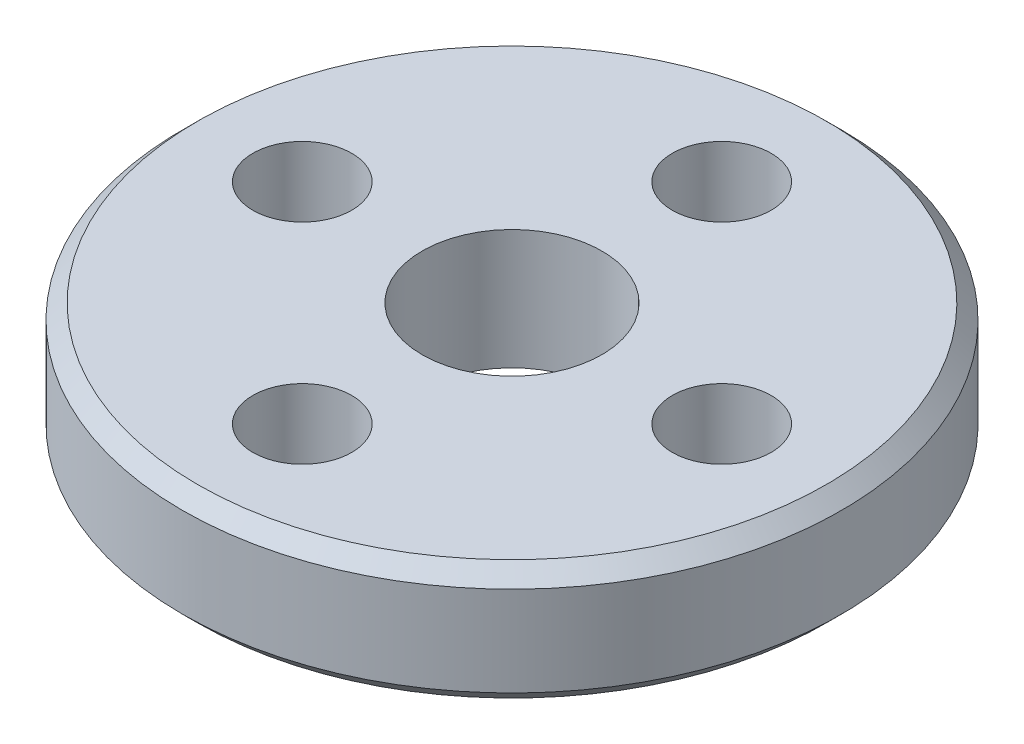
ISO-10303-21;
HEADER;
FILE_DESCRIPTION(('STEP AP214'),'2;1');
FILE_NAME('part.step','',(''),(''),'','','');
FILE_SCHEMA(('AUTOMOTIVE_DESIGN { 1 0 10303 214 1 1 1 1 }'));
ENDSEC;
DATA;
#1=APPLICATION_CONTEXT('core data for automotive mechanical design processes');
#2=APPLICATION_PROTOCOL_DEFINITION('international standard','automotive_design',2000,#1);
#3=PRODUCT_CONTEXT('',#1,'mechanical');
#4=PRODUCT('Part','Part','',(#3));
#5=PRODUCT_RELATED_PRODUCT_CATEGORY('part','',(#4));
#6=PRODUCT_DEFINITION_FORMATION('','',#4);
#7=PRODUCT_DEFINITION_CONTEXT('part definition',#1,'design');
#8=PRODUCT_DEFINITION('design','',#6,#7);
#9=PRODUCT_DEFINITION_SHAPE('','',#8);
#10=(LENGTH_UNIT() NAMED_UNIT(*) SI_UNIT(.MILLI.,.METRE.));
#11=(NAMED_UNIT(*) PLANE_ANGLE_UNIT() SI_UNIT($,.RADIAN.));
#12=(NAMED_UNIT(*) SI_UNIT($,.STERADIAN.) SOLID_ANGLE_UNIT());
#13=UNCERTAINTY_MEASURE_WITH_UNIT(LENGTH_MEASURE(1.E-05),#10,'distance_accuracy_value','');
#14=(GEOMETRIC_REPRESENTATION_CONTEXT(3) GLOBAL_UNCERTAINTY_ASSIGNED_CONTEXT((#13)) GLOBAL_UNIT_ASSIGNED_CONTEXT((#10,
#11,#12)) REPRESENTATION_CONTEXT('',''));
#15=CARTESIAN_POINT('',(0.,0.,0.));
#16=DIRECTION('',(0.,0.,1.));
#17=DIRECTION('',(1.,0.,0.));
#18=AXIS2_PLACEMENT_3D('',#15,#16,#17);
#19=CARTESIAN_POINT('',(0.,4.,0.));
#20=DIRECTION('',(0.,1.,0.));
#21=DIRECTION('',(0.,0.,1.));
#22=AXIS2_PLACEMENT_3D('',#19,#20,#21);
#23=PLANE('',#22);
#24=CARTESIAN_POINT('',(0.,4.,0.));
#25=DIRECTION('',(0.,1.,0.));
#26=DIRECTION('',(0.,0.,1.));
#27=AXIS2_PLACEMENT_3D('',#24,#25,#26);
#28=CIRCLE('',#27,10.5);
#29=CARTESIAN_POINT('',(0.,4.,10.5));
#30=VERTEX_POINT('',#29);
#31=EDGE_CURVE('E10',#30,#30,#28,.T.);
#32=ORIENTED_EDGE('',*,*,#31,.T.);
#33=EDGE_LOOP('',(#32));
#34=FACE_BOUND('',#33,.T.);
#35=CARTESIAN_POINT('',(0.,4.,7.));
#36=DIRECTION('',(0.,1.,0.));
#37=DIRECTION('',(0.,0.,1.));
#38=AXIS2_PLACEMENT_3D('',#35,#36,#37);
#39=CIRCLE('',#38,1.65);
#40=CARTESIAN_POINT('',(0.,4.,8.65));
#41=VERTEX_POINT('',#40);
#42=EDGE_CURVE('E80',#41,#41,#39,.T.);
#43=ORIENTED_EDGE('',*,*,#42,.F.);
#44=EDGE_LOOP('',(#43));
#45=FACE_BOUND('',#44,.T.);
#46=CARTESIAN_POINT('',(0.,4.,0.));
#47=DIRECTION('',(0.,1.,0.));
#48=DIRECTION('',(0.,0.,1.));
#49=AXIS2_PLACEMENT_3D('',#46,#47,#48);
#50=CIRCLE('',#49,3.);
#51=CARTESIAN_POINT('',(0.,4.,3.));
#52=VERTEX_POINT('',#51);
#53=EDGE_CURVE('E68',#52,#52,#50,.T.);
#54=ORIENTED_EDGE('',*,*,#53,.F.);
#55=EDGE_LOOP('',(#54));
#56=FACE_BOUND('',#55,.T.);
#57=CARTESIAN_POINT('',(0.,4.,-7.));
#58=DIRECTION('',(0.,1.,0.));
#59=DIRECTION('',(0.,0.,1.));
#60=AXIS2_PLACEMENT_3D('',#57,#58,#59);
#61=CIRCLE('',#60,1.65);
#62=CARTESIAN_POINT('',(0.,4.,-5.35));
#63=VERTEX_POINT('',#62);
#64=EDGE_CURVE('E61',#63,#63,#61,.T.);
#65=ORIENTED_EDGE('',*,*,#64,.F.);
#66=EDGE_LOOP('',(#65));
#67=FACE_BOUND('',#66,.T.);
#68=CARTESIAN_POINT('',(7.,4.,0.));
#69=DIRECTION('',(0.,1.,0.));
#70=DIRECTION('',(0.,0.,1.));
#71=AXIS2_PLACEMENT_3D('',#68,#69,#70);
#72=CIRCLE('',#71,1.65);
#73=CARTESIAN_POINT('',(7.,4.,1.65000000000002));
#74=VERTEX_POINT('',#73);
#75=EDGE_CURVE('E75',#74,#74,#72,.T.);
#76=ORIENTED_EDGE('',*,*,#75,.F.);
#77=EDGE_LOOP('',(#76));
#78=FACE_BOUND('',#77,.T.);
#79=CARTESIAN_POINT('',(-7.,4.,0.));
#80=DIRECTION('',(0.,1.,0.));
#81=DIRECTION('',(0.,0.,1.));
#82=AXIS2_PLACEMENT_3D('',#79,#80,#81);
#83=CIRCLE('',#82,1.65);
#84=CARTESIAN_POINT('',(-7.,4.,1.64999999999993));
#85=VERTEX_POINT('',#84);
#86=EDGE_CURVE('E85',#85,#85,#83,.T.);
#87=ORIENTED_EDGE('',*,*,#86,.F.);
#88=EDGE_LOOP('',(#87));
#89=FACE_BOUND('',#88,.T.);
#90=ADVANCED_FACE('F41',(#34,#45,#56,#67,#78,#89),#23,.T.);
#91=CARTESIAN_POINT('',(0.,0.,0.));
#92=DIRECTION('',(0.,1.,0.));
#93=DIRECTION('',(0.,0.,1.));
#94=AXIS2_PLACEMENT_3D('',#91,#92,#93);
#95=PLANE('',#94);
#96=CARTESIAN_POINT('',(0.,0.,0.));
#97=DIRECTION('',(0.,1.,0.));
#98=DIRECTION('',(0.,0.,1.));
#99=AXIS2_PLACEMENT_3D('',#96,#97,#98);
#100=CIRCLE('',#99,10.5);
#101=CARTESIAN_POINT('',(0.,0.,10.5));
#102=VERTEX_POINT('',#101);
#103=EDGE_CURVE('E47',#102,#102,#100,.F.);
#104=ORIENTED_EDGE('',*,*,#103,.T.);
#105=EDGE_LOOP('',(#104));
#106=FACE_BOUND('',#105,.T.);
#107=CARTESIAN_POINT('',(0.,0.,-7.));
#108=DIRECTION('',(0.,1.,0.));
#109=DIRECTION('',(0.,0.,1.));
#110=AXIS2_PLACEMENT_3D('',#107,#108,#109);
#111=CIRCLE('',#110,1.65);
#112=CARTESIAN_POINT('',(0.,0.,-5.35));
#113=VERTEX_POINT('',#112);
#114=EDGE_CURVE('E65',#113,#113,#111,.T.);
#115=ORIENTED_EDGE('',*,*,#114,.T.);
#116=EDGE_LOOP('',(#115));
#117=FACE_BOUND('',#116,.T.);
#118=CARTESIAN_POINT('',(0.,0.,0.));
#119=DIRECTION('',(0.,1.,0.));
#120=DIRECTION('',(0.,0.,1.));
#121=AXIS2_PLACEMENT_3D('',#118,#119,#120);
#122=CIRCLE('',#121,3.);
#123=CARTESIAN_POINT('',(0.,0.,3.));
#124=VERTEX_POINT('',#123);
#125=EDGE_CURVE('E70',#124,#124,#122,.T.);
#126=ORIENTED_EDGE('',*,*,#125,.T.);
#127=EDGE_LOOP('',(#126));
#128=FACE_BOUND('',#127,.T.);
#129=CARTESIAN_POINT('',(7.,0.,0.));
#130=DIRECTION('',(0.,1.,0.));
#131=DIRECTION('',(0.,0.,1.));
#132=AXIS2_PLACEMENT_3D('',#129,#130,#131);
#133=CIRCLE('',#132,1.65);
#134=CARTESIAN_POINT('',(7.,0.,1.65000000000002));
#135=VERTEX_POINT('',#134);
#136=EDGE_CURVE('E73',#135,#135,#133,.T.);
#137=ORIENTED_EDGE('',*,*,#136,.T.);
#138=EDGE_LOOP('',(#137));
#139=FACE_BOUND('',#138,.T.);
#140=CARTESIAN_POINT('',(0.,0.,7.));
#141=DIRECTION('',(0.,1.,0.));
#142=DIRECTION('',(0.,0.,1.));
#143=AXIS2_PLACEMENT_3D('',#140,#141,#142);
#144=CIRCLE('',#143,1.65);
#145=CARTESIAN_POINT('',(0.,0.,8.65));
#146=VERTEX_POINT('',#145);
#147=EDGE_CURVE('E83',#146,#146,#144,.T.);
#148=ORIENTED_EDGE('',*,*,#147,.T.);
#149=EDGE_LOOP('',(#148));
#150=FACE_BOUND('',#149,.T.);
#151=CARTESIAN_POINT('',(-7.,0.,0.));
#152=DIRECTION('',(0.,1.,0.));
#153=DIRECTION('',(0.,0.,1.));
#154=AXIS2_PLACEMENT_3D('',#151,#152,#153);
#155=CIRCLE('',#154,1.65);
#156=CARTESIAN_POINT('',(-7.,0.,1.64999999999993));
#157=VERTEX_POINT('',#156);
#158=EDGE_CURVE('E87',#157,#157,#155,.T.);
#159=ORIENTED_EDGE('',*,*,#158,.T.);
#160=EDGE_LOOP('',(#159));
#161=FACE_BOUND('',#160,.T.);
#162=ADVANCED_FACE('F100',(#106,#117,#128,#139,#150,#161),#95,.F.);
#163=CARTESIAN_POINT('',(0.,4.,0.));
#164=DIRECTION('',(0.,-1.,0.));
#165=DIRECTION('',(0.,0.,-1.));
#166=AXIS2_PLACEMENT_3D('',#163,#164,#165);
#167=CYLINDRICAL_SURFACE('',#166,11.);
#168=CARTESIAN_POINT('',(0.,0.500000000000002,0.));
#169=DIRECTION('',(0.,1.,0.));
#170=DIRECTION('',(0.,0.,1.));
#171=AXIS2_PLACEMENT_3D('',#168,#169,#170);
#172=CIRCLE('',#171,11.);
#173=CARTESIAN_POINT('',(0.,0.500000000000002,11.));
#174=VERTEX_POINT('',#173);
#175=EDGE_CURVE('E52',#174,#174,#172,.T.);
#176=ORIENTED_EDGE('',*,*,#175,.T.);
#177=EDGE_LOOP('',(#176));
#178=FACE_BOUND('',#177,.T.);
#179=CARTESIAN_POINT('',(0.,3.5,0.));
#180=DIRECTION('',(0.,1.,0.));
#181=DIRECTION('',(0.,0.,1.));
#182=AXIS2_PLACEMENT_3D('',#179,#180,#181);
#183=CIRCLE('',#182,11.);
#184=CARTESIAN_POINT('',(0.,3.5,11.));
#185=VERTEX_POINT('',#184);
#186=EDGE_CURVE('E60',#185,#185,#183,.F.);
#187=ORIENTED_EDGE('',*,*,#186,.T.);
#188=EDGE_LOOP('',(#187));
#189=FACE_BOUND('',#188,.T.);
#190=ADVANCED_FACE('F103',(#178,#189),#167,.T.);
#191=CARTESIAN_POINT('',(0.,4.,-7.));
#192=DIRECTION('',(0.,-1.,0.));
#193=DIRECTION('',(0.,0.,-1.));
#194=AXIS2_PLACEMENT_3D('',#191,#192,#193);
#195=CYLINDRICAL_SURFACE('',#194,1.65);
#196=ORIENTED_EDGE('',*,*,#64,.T.);
#197=EDGE_LOOP('',(#196));
#198=FACE_BOUND('',#197,.T.);
#199=ORIENTED_EDGE('',*,*,#114,.F.);
#200=EDGE_LOOP('',(#199));
#201=FACE_BOUND('',#200,.T.);
#202=ADVANCED_FACE('F110',(#198,#201),#195,.F.);
#203=CARTESIAN_POINT('',(0.,4.,0.));
#204=DIRECTION('',(0.,-1.,0.));
#205=DIRECTION('',(0.,0.,-1.));
#206=AXIS2_PLACEMENT_3D('',#203,#204,#205);
#207=CYLINDRICAL_SURFACE('',#206,3.);
#208=ORIENTED_EDGE('',*,*,#53,.T.);
#209=EDGE_LOOP('',(#208));
#210=FACE_BOUND('',#209,.T.);
#211=ORIENTED_EDGE('',*,*,#125,.F.);
#212=EDGE_LOOP('',(#211));
#213=FACE_BOUND('',#212,.T.);
#214=ADVANCED_FACE('F139',(#210,#213),#207,.F.);
#215=CARTESIAN_POINT('',(7.,4.,0.));
#216=DIRECTION('',(0.,-1.,0.));
#217=DIRECTION('',(0.,0.,-1.));
#218=AXIS2_PLACEMENT_3D('',#215,#216,#217);
#219=CYLINDRICAL_SURFACE('',#218,1.65);
#220=ORIENTED_EDGE('',*,*,#75,.T.);
#221=EDGE_LOOP('',(#220));
#222=FACE_BOUND('',#221,.T.);
#223=ORIENTED_EDGE('',*,*,#136,.F.);
#224=EDGE_LOOP('',(#223));
#225=FACE_BOUND('',#224,.T.);
#226=ADVANCED_FACE('F131',(#222,#225),#219,.F.);
#227=CARTESIAN_POINT('',(0.,4.,7.));
#228=DIRECTION('',(0.,-1.,0.));
#229=DIRECTION('',(0.,0.,-1.));
#230=AXIS2_PLACEMENT_3D('',#227,#228,#229);
#231=CYLINDRICAL_SURFACE('',#230,1.65);
#232=ORIENTED_EDGE('',*,*,#42,.T.);
#233=EDGE_LOOP('',(#232));
#234=FACE_BOUND('',#233,.T.);
#235=ORIENTED_EDGE('',*,*,#147,.F.);
#236=EDGE_LOOP('',(#235));
#237=FACE_BOUND('',#236,.T.);
#238=ADVANCED_FACE('F124',(#234,#237),#231,.F.);
#239=CARTESIAN_POINT('',(-7.,4.,0.));
#240=DIRECTION('',(0.,-1.,0.));
#241=DIRECTION('',(0.,0.,-1.));
#242=AXIS2_PLACEMENT_3D('',#239,#240,#241);
#243=CYLINDRICAL_SURFACE('',#242,1.65);
#244=ORIENTED_EDGE('',*,*,#86,.T.);
#245=EDGE_LOOP('',(#244));
#246=FACE_BOUND('',#245,.T.);
#247=ORIENTED_EDGE('',*,*,#158,.F.);
#248=EDGE_LOOP('',(#247));
#249=FACE_BOUND('',#248,.T.);
#250=ADVANCED_FACE('F91',(#246,#249),#243,.F.);
#251=CARTESIAN_POINT('',(0.,0.500000000000002,0.));
#252=DIRECTION('',(0.,1.,0.));
#253=DIRECTION('',(0.,0.,1.));
#254=AXIS2_PLACEMENT_3D('',#251,#252,#253);
#255=CONICAL_SURFACE('',#254,11.,0.78539816339745);
#256=ORIENTED_EDGE('',*,*,#103,.F.);
#257=EDGE_LOOP('',(#256));
#258=FACE_BOUND('',#257,.T.);
#259=ORIENTED_EDGE('',*,*,#175,.F.);
#260=EDGE_LOOP('',(#259));
#261=FACE_BOUND('',#260,.T.);
#262=ADVANCED_FACE('F114',(#258,#261),#255,.T.);
#263=CARTESIAN_POINT('',(0.,4.,0.));
#264=DIRECTION('',(0.,-1.,0.));
#265=DIRECTION('',(0.,0.,-1.));
#266=AXIS2_PLACEMENT_3D('',#263,#264,#265);
#267=CONICAL_SURFACE('',#266,10.5,0.785398163397445);
#268=ORIENTED_EDGE('',*,*,#186,.F.);
#269=EDGE_LOOP('',(#268));
#270=FACE_BOUND('',#269,.T.);
#271=ORIENTED_EDGE('',*,*,#31,.F.);
#272=EDGE_LOOP('',(#271));
#273=FACE_BOUND('',#272,.T.);
#274=ADVANCED_FACE('F42',(#270,#273),#267,.T.);
#275=CLOSED_SHELL('',(#90,#162,#190,#202,#214,#226,#238,#250,#262,#274));
#276=MANIFOLD_SOLID_BREP('B2',#275);
#277=ADVANCED_BREP_SHAPE_REPRESENTATION('',(#18,#276),#14);
#278=SHAPE_DEFINITION_REPRESENTATION(#9,#277);
ENDSEC;
END-ISO-10303-21;
